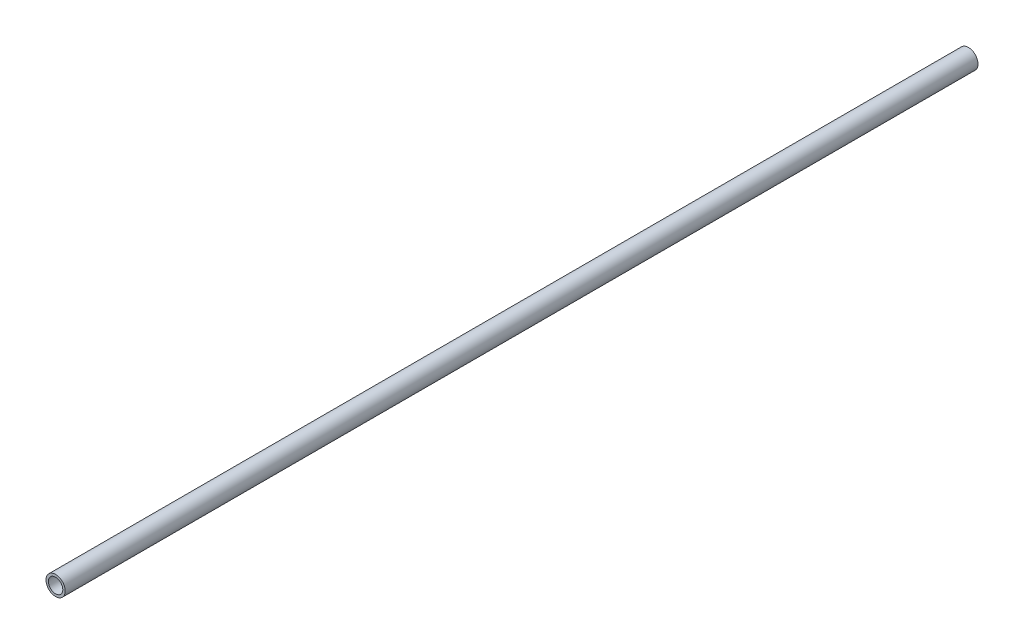
ISO-10303-21;
HEADER;
FILE_DESCRIPTION(('STEP AP214'),'2;1');
FILE_NAME('part.step','',(''),(''),'','','');
FILE_SCHEMA(('AUTOMOTIVE_DESIGN { 1 0 10303 214 1 1 1 1 }'));
ENDSEC;
DATA;
#1=APPLICATION_CONTEXT('core data for automotive mechanical design processes');
#2=APPLICATION_PROTOCOL_DEFINITION('international standard','automotive_design',2000,#1);
#3=PRODUCT_CONTEXT('',#1,'mechanical');
#4=PRODUCT('Part','Part','',(#3));
#5=PRODUCT_RELATED_PRODUCT_CATEGORY('part','',(#4));
#6=PRODUCT_DEFINITION_FORMATION('','',#4);
#7=PRODUCT_DEFINITION_CONTEXT('part definition',#1,'design');
#8=PRODUCT_DEFINITION('design','',#6,#7);
#9=PRODUCT_DEFINITION_SHAPE('','',#8);
#10=(LENGTH_UNIT() NAMED_UNIT(*) SI_UNIT(.MILLI.,.METRE.));
#11=(NAMED_UNIT(*) PLANE_ANGLE_UNIT() SI_UNIT($,.RADIAN.));
#12=(NAMED_UNIT(*) SI_UNIT($,.STERADIAN.) SOLID_ANGLE_UNIT());
#13=UNCERTAINTY_MEASURE_WITH_UNIT(LENGTH_MEASURE(1.E-05),#10,'distance_accuracy_value','');
#14=(GEOMETRIC_REPRESENTATION_CONTEXT(3) GLOBAL_UNCERTAINTY_ASSIGNED_CONTEXT((#13)) GLOBAL_UNIT_ASSIGNED_CONTEXT((#10,
#11,#12)) REPRESENTATION_CONTEXT('',''));
#15=CARTESIAN_POINT('',(0.,0.,0.));
#16=DIRECTION('',(0.,0.,1.));
#17=DIRECTION('',(1.,0.,0.));
#18=AXIS2_PLACEMENT_3D('',#15,#16,#17);
#19=CARTESIAN_POINT('',(0.,0.,380.));
#20=DIRECTION('',(0.,0.,1.));
#21=DIRECTION('',(1.,0.,0.));
#22=AXIS2_PLACEMENT_3D('',#19,#20,#21);
#23=PLANE('',#22);
#24=CARTESIAN_POINT('',(0.,0.,380.));
#25=DIRECTION('',(0.,0.,1.));
#26=DIRECTION('',(1.,0.,0.));
#27=AXIS2_PLACEMENT_3D('',#24,#25,#26);
#28=CIRCLE('',#27,4.);
#29=CARTESIAN_POINT('',(4.,0.,380.));
#30=VERTEX_POINT('',#29);
#31=EDGE_CURVE('E10',#30,#30,#28,.T.);
#32=ORIENTED_EDGE('',*,*,#31,.T.);
#33=EDGE_LOOP('',(#32));
#34=FACE_BOUND('',#33,.T.);
#35=CARTESIAN_POINT('',(0.,0.,380.));
#36=DIRECTION('',(0.,0.,1.));
#37=DIRECTION('',(1.,0.,0.));
#38=AXIS2_PLACEMENT_3D('',#35,#36,#37);
#39=CIRCLE('',#38,3.);
#40=CARTESIAN_POINT('',(3.,0.,380.));
#41=VERTEX_POINT('',#40);
#42=EDGE_CURVE('E42',#41,#41,#39,.T.);
#43=ORIENTED_EDGE('',*,*,#42,.F.);
#44=EDGE_LOOP('',(#43));
#45=FACE_BOUND('',#44,.T.);
#46=ADVANCED_FACE('F31',(#34,#45),#23,.T.);
#47=CARTESIAN_POINT('',(0.,0.,0.));
#48=DIRECTION('',(0.,0.,1.));
#49=DIRECTION('',(1.,0.,0.));
#50=AXIS2_PLACEMENT_3D('',#47,#48,#49);
#51=PLANE('',#50);
#52=CARTESIAN_POINT('',(0.,0.,0.));
#53=DIRECTION('',(0.,0.,1.));
#54=DIRECTION('',(1.,0.,0.));
#55=AXIS2_PLACEMENT_3D('',#52,#53,#54);
#56=CIRCLE('',#55,4.);
#57=CARTESIAN_POINT('',(4.,0.,0.));
#58=VERTEX_POINT('',#57);
#59=EDGE_CURVE('E35',#58,#58,#56,.T.);
#60=ORIENTED_EDGE('',*,*,#59,.F.);
#61=EDGE_LOOP('',(#60));
#62=FACE_BOUND('',#61,.T.);
#63=CARTESIAN_POINT('',(0.,0.,0.));
#64=DIRECTION('',(0.,0.,1.));
#65=DIRECTION('',(1.,0.,0.));
#66=AXIS2_PLACEMENT_3D('',#63,#64,#65);
#67=CIRCLE('',#66,3.);
#68=CARTESIAN_POINT('',(3.,0.,0.));
#69=VERTEX_POINT('',#68);
#70=EDGE_CURVE('E44',#69,#69,#67,.T.);
#71=ORIENTED_EDGE('',*,*,#70,.T.);
#72=EDGE_LOOP('',(#71));
#73=FACE_BOUND('',#72,.T.);
#74=ADVANCED_FACE('F54',(#62,#73),#51,.F.);
#75=CARTESIAN_POINT('',(0.,0.,380.));
#76=DIRECTION('',(0.,0.,-1.));
#77=DIRECTION('',(-1.,0.,0.));
#78=AXIS2_PLACEMENT_3D('',#75,#76,#77);
#79=CYLINDRICAL_SURFACE('',#78,4.);
#80=ORIENTED_EDGE('',*,*,#31,.F.);
#81=EDGE_LOOP('',(#80));
#82=FACE_BOUND('',#81,.T.);
#83=ORIENTED_EDGE('',*,*,#59,.T.);
#84=EDGE_LOOP('',(#83));
#85=FACE_BOUND('',#84,.T.);
#86=ADVANCED_FACE('F33',(#82,#85),#79,.T.);
#87=CARTESIAN_POINT('',(0.,0.,380.));
#88=DIRECTION('',(0.,0.,-1.));
#89=DIRECTION('',(-1.,0.,0.));
#90=AXIS2_PLACEMENT_3D('',#87,#88,#89);
#91=CYLINDRICAL_SURFACE('',#90,3.);
#92=ORIENTED_EDGE('',*,*,#42,.T.);
#93=EDGE_LOOP('',(#92));
#94=FACE_BOUND('',#93,.T.);
#95=ORIENTED_EDGE('',*,*,#70,.F.);
#96=EDGE_LOOP('',(#95));
#97=FACE_BOUND('',#96,.T.);
#98=ADVANCED_FACE('F50',(#94,#97),#91,.F.);
#99=CLOSED_SHELL('',(#46,#74,#86,#98));
#100=MANIFOLD_SOLID_BREP('B2',#99);
#101=ADVANCED_BREP_SHAPE_REPRESENTATION('',(#18,#100),#14);
#102=SHAPE_DEFINITION_REPRESENTATION(#9,#101);
ENDSEC;
END-ISO-10303-21;
